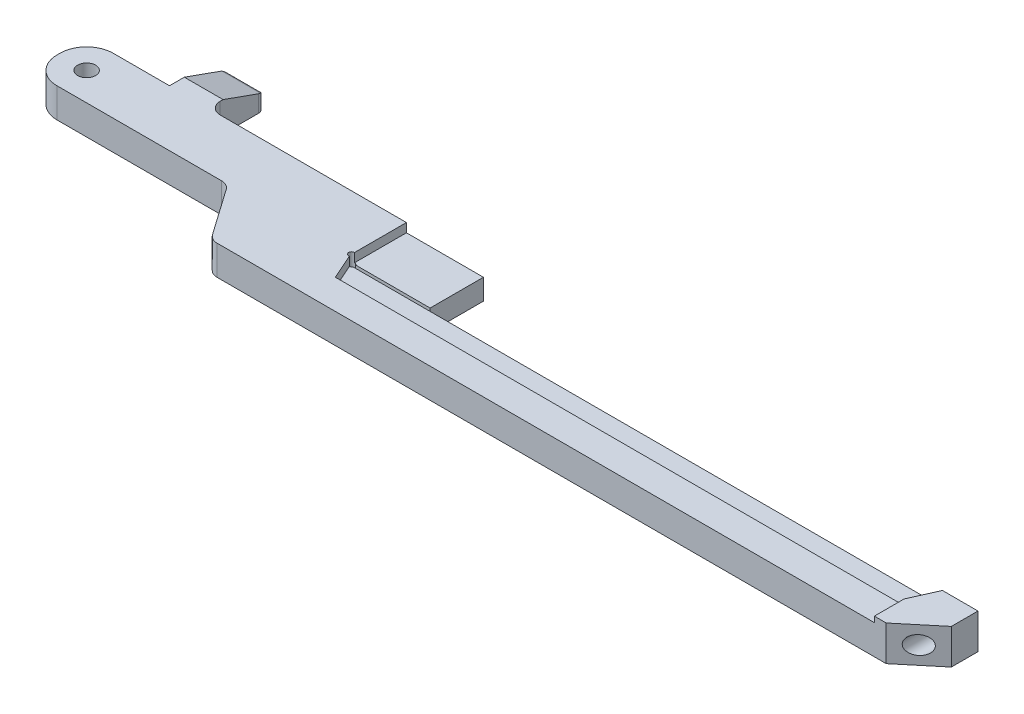
ISO-10303-21;
HEADER;
FILE_DESCRIPTION(('STEP AP214'),'2;1');
FILE_NAME('part.step','',(''),(''),'','','');
FILE_SCHEMA(('AUTOMOTIVE_DESIGN { 1 0 10303 214 1 1 1 1 }'));
ENDSEC;
DATA;
#1=APPLICATION_CONTEXT('core data for automotive mechanical design processes');
#2=APPLICATION_PROTOCOL_DEFINITION('international standard','automotive_design',2000,#1);
#3=PRODUCT_CONTEXT('',#1,'mechanical');
#4=PRODUCT('Part','Part','',(#3));
#5=PRODUCT_RELATED_PRODUCT_CATEGORY('part','',(#4));
#6=PRODUCT_DEFINITION_FORMATION('','',#4);
#7=PRODUCT_DEFINITION_CONTEXT('part definition',#1,'design');
#8=PRODUCT_DEFINITION('design','',#6,#7);
#9=PRODUCT_DEFINITION_SHAPE('','',#8);
#10=(LENGTH_UNIT() NAMED_UNIT(*) SI_UNIT(.MILLI.,.METRE.));
#11=(NAMED_UNIT(*) PLANE_ANGLE_UNIT() SI_UNIT($,.RADIAN.));
#12=(NAMED_UNIT(*) SI_UNIT($,.STERADIAN.) SOLID_ANGLE_UNIT());
#13=UNCERTAINTY_MEASURE_WITH_UNIT(LENGTH_MEASURE(1.E-05),#10,'distance_accuracy_value','');
#14=(GEOMETRIC_REPRESENTATION_CONTEXT(3) GLOBAL_UNCERTAINTY_ASSIGNED_CONTEXT((#13)) GLOBAL_UNIT_ASSIGNED_CONTEXT((#10,
#11,#12)) REPRESENTATION_CONTEXT('',''));
#15=CARTESIAN_POINT('',(0.,0.,0.));
#16=DIRECTION('',(0.,0.,1.));
#17=DIRECTION('',(1.,0.,0.));
#18=AXIS2_PLACEMENT_3D('',#15,#16,#17);
#19=CARTESIAN_POINT('',(0.,5.,0.));
#20=DIRECTION('',(0.,1.,0.));
#21=DIRECTION('',(0.,0.,1.));
#22=AXIS2_PLACEMENT_3D('',#19,#20,#21);
#23=PLANE('',#22);
#24=CARTESIAN_POINT('',(25.75,5.,4.75));
#25=DIRECTION('',(0.,1.,0.));
#26=DIRECTION('',(0.,0.,1.));
#27=AXIS2_PLACEMENT_3D('',#24,#25,#26);
#28=CIRCLE('',#27,1.525);
#29=CARTESIAN_POINT('',(25.75,5.,6.275));
#30=VERTEX_POINT('',#29);
#31=EDGE_CURVE('E333',#30,#30,#28,.T.);
#32=ORIENTED_EDGE('',*,*,#31,.F.);
#33=EDGE_LOOP('',(#32));
#34=FACE_BOUND('',#33,.T.);
#35=DIRECTION('',(-0.574425749096431,0.,-0.818556692462412));
#36=VECTOR('',#35,1.);
#37=CARTESIAN_POINT('',(31.9383378016085,5.,-22.4128686327078));
#38=LINE('',#37,#36);
#39=CARTESIAN_POINT('',(60.4027028057494,5.,18.1488514981929));
#40=VERTEX_POINT('',#39);
#41=CARTESIAN_POINT('',(54.9306305275839,5.,10.3511485018071));
#42=VERTEX_POINT('',#41);
#43=EDGE_CURVE('E284',#40,#42,#38,.T.);
#44=ORIENTED_EDGE('',*,*,#43,.F.);
#45=CARTESIAN_POINT('',(62.0398161906742,5.,17.));
#46=DIRECTION('',(0.,1.,0.));
#47=DIRECTION('',(0.,0.,1.));
#48=AXIS2_PLACEMENT_3D('',#45,#46,#47);
#49=CIRCLE('',#48,2.);
#50=CARTESIAN_POINT('',(62.0398161906742,5.,19.));
#51=VERTEX_POINT('',#50);
#52=EDGE_CURVE('E394',#40,#51,#49,.T.);
#53=ORIENTED_EDGE('',*,*,#52,.T.);
#54=DIRECTION('',(-1.,0.,0.));
#55=VECTOR('',#54,1.);
#56=CARTESIAN_POINT('',(0.,5.,19.0000000000001));
#57=LINE('',#56,#55);
#58=CARTESIAN_POINT('',(173.,5.,19.));
#59=VERTEX_POINT('',#58);
#60=EDGE_CURVE('E287',#59,#51,#57,.T.);
#61=ORIENTED_EDGE('',*,*,#60,.F.);
#62=DIRECTION('',(0.,0.,-1.));
#63=VECTOR('',#62,1.);
#64=CARTESIAN_POINT('',(173.,5.,0.));
#65=LINE('',#64,#63);
#66=CARTESIAN_POINT('',(173.,5.,14.));
#67=VERTEX_POINT('',#66);
#68=EDGE_CURVE('E488',#59,#67,#65,.T.);
#69=ORIENTED_EDGE('',*,*,#68,.T.);
#70=DIRECTION('',(1.,0.,0.));
#71=VECTOR('',#70,1.);
#72=CARTESIAN_POINT('',(173.,5.,14.));
#73=LINE('',#72,#71);
#74=CARTESIAN_POINT('',(77.,5.,14.));
#75=VERTEX_POINT('',#74);
#76=EDGE_CURVE('E491',#75,#67,#73,.T.);
#77=ORIENTED_EDGE('',*,*,#76,.F.);
#78=DIRECTION('',(-0.406138466053451,0.,-0.913811548620256));
#79=VECTOR('',#78,1.);
#80=CARTESIAN_POINT('',(59.1030927835049,5.,-26.2680412371136));
#81=LINE('',#80,#79);
#82=CARTESIAN_POINT('',(75.1060546548658,5.,9.73862297344813));
#83=VERTEX_POINT('',#82);
#84=EDGE_CURVE('E351',#75,#83,#81,.T.);
#85=ORIENTED_EDGE('',*,*,#84,.T.);
#86=CARTESIAN_POINT('',(75.,5.,9.25));
#87=DIRECTION('',(0.,1.,0.));
#88=DIRECTION('',(0.,0.,1.));
#89=AXIS2_PLACEMENT_3D('',#86,#87,#88);
#90=CIRCLE('',#89,0.500000000000002);
#91=CARTESIAN_POINT('',(75.,5.,8.75));
#92=VERTEX_POINT('',#91);
#93=EDGE_CURVE('E273',#92,#83,#90,.T.);
#94=ORIENTED_EDGE('',*,*,#93,.F.);
#95=DIRECTION('',(0.,0.,1.));
#96=VECTOR('',#95,1.);
#97=CARTESIAN_POINT('',(75.,5.,9.));
#98=LINE('',#97,#96);
#99=CARTESIAN_POINT('',(75.,5.,0.));
#100=VERTEX_POINT('',#99);
#101=EDGE_CURVE('E545',#100,#92,#98,.T.);
#102=ORIENTED_EDGE('',*,*,#101,.F.);
#103=DIRECTION('',(-1.,0.,0.));
#104=VECTOR('',#103,1.);
#105=CARTESIAN_POINT('',(0.,5.,0.));
#106=LINE('',#105,#104);
#107=CARTESIAN_POINT('',(43.55,5.,0.));
#108=VERTEX_POINT('',#107);
#109=EDGE_CURVE('E269',#100,#108,#106,.T.);
#110=ORIENTED_EDGE('',*,*,#109,.T.);
#111=CARTESIAN_POINT('',(43.55,5.,-2.));
#112=DIRECTION('',(0.,1.,0.));
#113=DIRECTION('',(0.,0.,1.));
#114=AXIS2_PLACEMENT_3D('',#111,#112,#113);
#115=CIRCLE('',#114,2.);
#116=CARTESIAN_POINT('',(41.55,5.,-2.));
#117=VERTEX_POINT('',#116);
#118=EDGE_CURVE('E267',#108,#117,#115,.F.);
#119=ORIENTED_EDGE('',*,*,#118,.T.);
#120=DIRECTION('',(0.,0.,1.));
#121=VECTOR('',#120,1.);
#122=CARTESIAN_POINT('',(41.55,5.,0.));
#123=LINE('',#122,#121);
#124=CARTESIAN_POINT('',(41.55,5.,-2.5));
#125=VERTEX_POINT('',#124);
#126=EDGE_CURVE('E250',#125,#117,#123,.T.);
#127=ORIENTED_EDGE('',*,*,#126,.F.);
#128=DIRECTION('',(-1.,0.,0.));
#129=VECTOR('',#128,1.);
#130=CARTESIAN_POINT('',(181.,5.,-2.5));
#131=LINE('',#130,#129);
#132=CARTESIAN_POINT('',(35.,5.,-2.5));
#133=VERTEX_POINT('',#132);
#134=EDGE_CURVE('E255',#125,#133,#131,.T.);
#135=ORIENTED_EDGE('',*,*,#134,.T.);
#136=DIRECTION('',(0.,0.,1.));
#137=VECTOR('',#136,1.);
#138=CARTESIAN_POINT('',(35.,5.,0.));
#139=LINE('',#138,#137);
#140=CARTESIAN_POINT('',(35.,5.,0.));
#141=VERTEX_POINT('',#140);
#142=EDGE_CURVE('E268',#133,#141,#139,.T.);
#143=ORIENTED_EDGE('',*,*,#142,.T.);
#144=DIRECTION('',(-1.,0.,0.));
#145=VECTOR('',#144,1.);
#146=CARTESIAN_POINT('',(0.,5.,0.));
#147=LINE('',#146,#145);
#148=CARTESIAN_POINT('',(25.5,5.,0.));
#149=VERTEX_POINT('',#148);
#150=EDGE_CURVE('E271',#141,#149,#147,.T.);
#151=ORIENTED_EDGE('',*,*,#150,.T.);
#152=CARTESIAN_POINT('',(25.5,5.,4.5));
#153=DIRECTION('',(0.,1.,0.));
#154=DIRECTION('',(0.,0.,1.));
#155=AXIS2_PLACEMENT_3D('',#152,#153,#154);
#156=CIRCLE('',#155,4.5);
#157=CARTESIAN_POINT('',(21.,5.,4.5));
#158=VERTEX_POINT('',#157);
#159=EDGE_CURVE('E374',#149,#158,#156,.T.);
#160=ORIENTED_EDGE('',*,*,#159,.T.);
#161=DIRECTION('',(0.,0.,-1.));
#162=VECTOR('',#161,1.);
#163=CARTESIAN_POINT('',(21.,5.,0.));
#164=LINE('',#163,#162);
#165=CARTESIAN_POINT('',(21.,5.,5.));
#166=VERTEX_POINT('',#165);
#167=EDGE_CURVE('E279',#166,#158,#164,.T.);
#168=ORIENTED_EDGE('',*,*,#167,.F.);
#169=CARTESIAN_POINT('',(25.5,5.,5.));
#170=DIRECTION('',(0.,1.,0.));
#171=DIRECTION('',(0.,0.,1.));
#172=AXIS2_PLACEMENT_3D('',#169,#170,#171);
#173=CIRCLE('',#172,4.5);
#174=CARTESIAN_POINT('',(25.5,5.,9.5));
#175=VERTEX_POINT('',#174);
#176=EDGE_CURVE('E376',#166,#175,#173,.T.);
#177=ORIENTED_EDGE('',*,*,#176,.T.);
#178=DIRECTION('',(-1.,0.,0.));
#179=VECTOR('',#178,1.);
#180=CARTESIAN_POINT('',(0.,5.,9.5));
#181=LINE('',#180,#179);
#182=CARTESIAN_POINT('',(53.2935171426591,5.,9.5));
#183=VERTEX_POINT('',#182);
#184=EDGE_CURVE('E282',#183,#175,#181,.T.);
#185=ORIENTED_EDGE('',*,*,#184,.F.);
#186=CARTESIAN_POINT('',(53.2935171426591,5.,11.5));
#187=DIRECTION('',(0.,1.,0.));
#188=DIRECTION('',(0.,0.,1.));
#189=AXIS2_PLACEMENT_3D('',#186,#187,#188);
#190=CIRCLE('',#189,2.);
#191=EDGE_CURVE('E402',#183,#42,#190,.F.);
#192=ORIENTED_EDGE('',*,*,#191,.T.);
#193=EDGE_LOOP('',(#44,#53,#61,#69,#77,#85,#94,#102,#110,#119,#127,#135,#143,#151,#160,#168,
#177,#185,#192));
#194=FACE_BOUND('',#193,.T.);
#195=ADVANCED_FACE('F40',(#34,#194),#23,.T.);
#196=CARTESIAN_POINT('',(41.55,5.,0.));
#197=DIRECTION('',(1.,0.,0.));
#198=DIRECTION('',(0.,0.,-1.));
#199=AXIS2_PLACEMENT_3D('',#196,#197,#198);
#200=PLANE('',#199);
#201=DIRECTION('',(0.,0.,1.));
#202=VECTOR('',#201,1.);
#203=CARTESIAN_POINT('',(41.55,0.,0.));
#204=LINE('',#203,#202);
#205=CARTESIAN_POINT('',(41.55,0.,-8.5));
#206=VERTEX_POINT('',#205);
#207=CARTESIAN_POINT('',(41.55,0.,-2.));
#208=VERTEX_POINT('',#207);
#209=EDGE_CURVE('E304',#206,#208,#204,.T.);
#210=ORIENTED_EDGE('',*,*,#209,.F.);
#211=DIRECTION('',(0.,-1.,0.));
#212=VECTOR('',#211,1.);
#213=CARTESIAN_POINT('',(41.55,5.,-8.5));
#214=LINE('',#213,#212);
#215=CARTESIAN_POINT('',(41.55,2.85714285714286,-8.5));
#216=VERTEX_POINT('',#215);
#217=EDGE_CURVE('E253',#206,#216,#214,.F.);
#218=ORIENTED_EDGE('',*,*,#217,.T.);
#219=DIRECTION('',(0.,0.336336396998156,0.941741911594838));
#220=VECTOR('',#219,1.);
#221=CARTESIAN_POINT('',(41.55,5.79185520361991,-0.282805429864254));
#222=LINE('',#221,#220);
#223=EDGE_CURVE('E244',#216,#125,#222,.T.);
#224=ORIENTED_EDGE('',*,*,#223,.T.);
#225=ORIENTED_EDGE('',*,*,#126,.T.);
#226=DIRECTION('',(0.,-1.,0.));
#227=VECTOR('',#226,1.);
#228=CARTESIAN_POINT('',(41.55,5.,-2.));
#229=LINE('',#228,#227);
#230=EDGE_CURVE('E396',#117,#208,#229,.T.);
#231=ORIENTED_EDGE('',*,*,#230,.T.);
#232=EDGE_LOOP('',(#210,#218,#224,#225,#231));
#233=FACE_BOUND('',#232,.T.);
#234=ADVANCED_FACE('F247',(#233),#200,.T.);
#235=CARTESIAN_POINT('',(0.,5.,-9.5));
#236=DIRECTION('',(0.,0.,-1.));
#237=DIRECTION('',(-1.,0.,0.));
#238=AXIS2_PLACEMENT_3D('',#235,#236,#237);
#239=PLANE('',#238);
#240=DIRECTION('',(-1.,0.,0.));
#241=VECTOR('',#240,1.);
#242=CARTESIAN_POINT('',(0.,1.79528080376296,-9.5));
#243=LINE('',#242,#241);
#244=CARTESIAN_POINT('',(36.,1.79528080376296,-9.5));
#245=VERTEX_POINT('',#244);
#246=CARTESIAN_POINT('',(40.55,1.79528080376296,-9.5));
#247=VERTEX_POINT('',#246);
#248=EDGE_CURVE('E407',#245,#247,#243,.F.);
#249=ORIENTED_EDGE('',*,*,#248,.T.);
#250=DIRECTION('',(0.,-1.,0.));
#251=VECTOR('',#250,1.);
#252=CARTESIAN_POINT('',(40.55,5.,-9.5));
#253=LINE('',#252,#251);
#254=CARTESIAN_POINT('',(40.55,0.,-9.5));
#255=VERTEX_POINT('',#254);
#256=EDGE_CURVE('E411',#247,#255,#253,.T.);
#257=ORIENTED_EDGE('',*,*,#256,.T.);
#258=DIRECTION('',(1.,0.,0.));
#259=VECTOR('',#258,1.);
#260=CARTESIAN_POINT('',(0.,0.,-9.5));
#261=LINE('',#260,#259);
#262=CARTESIAN_POINT('',(36.,0.,-9.5));
#263=VERTEX_POINT('',#262);
#264=EDGE_CURVE('E306',#263,#255,#261,.T.);
#265=ORIENTED_EDGE('',*,*,#264,.F.);
#266=DIRECTION('',(0.,-1.,0.));
#267=VECTOR('',#266,1.);
#268=CARTESIAN_POINT('',(36.,2.5,-9.5));
#269=LINE('',#268,#267);
#270=EDGE_CURVE('E409',#263,#245,#269,.F.);
#271=ORIENTED_EDGE('',*,*,#270,.T.);
#272=EDGE_LOOP('',(#249,#257,#265,#271));
#273=FACE_BOUND('',#272,.T.);
#274=ADVANCED_FACE('F602',(#273),#239,.T.);
#275=CARTESIAN_POINT('',(35.,5.,0.));
#276=DIRECTION('',(1.,0.,0.));
#277=DIRECTION('',(0.,0.,-1.));
#278=AXIS2_PLACEMENT_3D('',#275,#276,#277);
#279=PLANE('',#278);
#280=DIRECTION('',(0.,0.336336396998156,0.941741911594838));
#281=VECTOR('',#280,1.);
#282=CARTESIAN_POINT('',(35.,5.79185520361991,-0.282805429864254));
#283=LINE('',#282,#281);
#284=CARTESIAN_POINT('',(35.,2.85714285714286,-8.5));
#285=VERTEX_POINT('',#284);
#286=EDGE_CURVE('E260',#285,#133,#283,.T.);
#287=ORIENTED_EDGE('',*,*,#286,.F.);
#288=DIRECTION('',(0.,-1.,0.));
#289=VECTOR('',#288,1.);
#290=CARTESIAN_POINT('',(35.,0.,-8.5));
#291=LINE('',#290,#289);
#292=CARTESIAN_POINT('',(35.,0.,-8.5));
#293=VERTEX_POINT('',#292);
#294=EDGE_CURVE('E11',#285,#293,#291,.T.);
#295=ORIENTED_EDGE('',*,*,#294,.T.);
#296=DIRECTION('',(0.,0.,1.));
#297=VECTOR('',#296,1.);
#298=CARTESIAN_POINT('',(35.,0.,0.));
#299=LINE('',#298,#297);
#300=CARTESIAN_POINT('',(35.,0.,0.));
#301=VERTEX_POINT('',#300);
#302=EDGE_CURVE('E309',#293,#301,#299,.T.);
#303=ORIENTED_EDGE('',*,*,#302,.T.);
#304=DIRECTION('',(0.,-1.,0.));
#305=VECTOR('',#304,1.);
#306=CARTESIAN_POINT('',(35.,5.,0.));
#307=LINE('',#306,#305);
#308=EDGE_CURVE('E342',#141,#301,#307,.T.);
#309=ORIENTED_EDGE('',*,*,#308,.F.);
#310=ORIENTED_EDGE('',*,*,#142,.F.);
#311=EDGE_LOOP('',(#287,#295,#303,#309,#310));
#312=FACE_BOUND('',#311,.T.);
#313=ADVANCED_FACE('F437',(#312),#279,.F.);
#314=CARTESIAN_POINT('',(75.,5.,9.25));
#315=DIRECTION('',(0.,-1.,0.));
#316=DIRECTION('',(0.,0.,-1.));
#317=AXIS2_PLACEMENT_3D('',#314,#315,#316);
#318=CYLINDRICAL_SURFACE('',#317,0.500000000000002);
#319=CARTESIAN_POINT('',(75.,3.5,9.25));
#320=DIRECTION('',(0.,-1.,0.));
#321=DIRECTION('',(0.,0.,-1.));
#322=AXIS2_PLACEMENT_3D('',#319,#320,#321);
#323=CIRCLE('',#322,0.500000000000002);
#324=CARTESIAN_POINT('',(75.,3.5,8.75));
#325=VERTEX_POINT('',#324);
#326=CARTESIAN_POINT('',(75.4330127018922,3.5,9.));
#327=VERTEX_POINT('',#326);
#328=EDGE_CURVE('E295',#325,#327,#323,.T.);
#329=ORIENTED_EDGE('',*,*,#328,.F.);
#330=DIRECTION('',(0.,-1.,0.));
#331=VECTOR('',#330,1.);
#332=CARTESIAN_POINT('',(75.,5.,8.75));
#333=LINE('',#332,#331);
#334=EDGE_CURVE('E531',#325,#92,#333,.F.);
#335=ORIENTED_EDGE('',*,*,#334,.T.);
#336=ORIENTED_EDGE('',*,*,#93,.T.);
#337=DIRECTION('',(0.,-1.,0.));
#338=VECTOR('',#337,1.);
#339=CARTESIAN_POINT('',(75.1060546548658,5.,9.73862297344813));
#340=LINE('',#339,#338);
#341=CARTESIAN_POINT('',(75.1060546548658,3.5,9.73862297344813));
#342=VERTEX_POINT('',#341);
#343=EDGE_CURVE('E528',#83,#342,#340,.T.);
#344=ORIENTED_EDGE('',*,*,#343,.T.);
#345=CARTESIAN_POINT('',(75.,3.5,9.25));
#346=DIRECTION('',(0.,-1.,0.));
#347=DIRECTION('',(0.,0.,-1.));
#348=AXIS2_PLACEMENT_3D('',#345,#346,#347);
#349=CIRCLE('',#348,0.500000000000002);
#350=CARTESIAN_POINT('',(75.4330127018922,3.5,9.5));
#351=VERTEX_POINT('',#350);
#352=EDGE_CURVE('E534',#351,#342,#349,.T.);
#353=ORIENTED_EDGE('',*,*,#352,.F.);
#354=DIRECTION('',(0.,-1.,0.));
#355=VECTOR('',#354,1.);
#356=CARTESIAN_POINT('',(75.4330127018922,5.,9.5));
#357=LINE('',#356,#355);
#358=CARTESIAN_POINT('',(75.4330127018922,0.,9.5));
#359=VERTEX_POINT('',#358);
#360=EDGE_CURVE('E290',#351,#359,#357,.T.);
#361=ORIENTED_EDGE('',*,*,#360,.T.);
#362=CARTESIAN_POINT('',(75.,0.,9.25));
#363=DIRECTION('',(0.,1.,0.));
#364=DIRECTION('',(0.,0.,1.));
#365=AXIS2_PLACEMENT_3D('',#362,#363,#364);
#366=CIRCLE('',#365,0.500000000000002);
#367=CARTESIAN_POINT('',(75.4330127018922,0.,9.));
#368=VERTEX_POINT('',#367);
#369=EDGE_CURVE('E291',#368,#359,#366,.T.);
#370=ORIENTED_EDGE('',*,*,#369,.F.);
#371=DIRECTION('',(0.,-1.,0.));
#372=VECTOR('',#371,1.);
#373=CARTESIAN_POINT('',(75.4330127018922,5.,9.));
#374=LINE('',#373,#372);
#375=EDGE_CURVE('E349',#327,#368,#374,.T.);
#376=ORIENTED_EDGE('',*,*,#375,.F.);
#377=EDGE_LOOP('',(#329,#335,#336,#344,#353,#361,#370,#376));
#378=FACE_BOUND('',#377,.T.);
#379=ADVANCED_FACE('F542',(#378),#318,.F.);
#380=CARTESIAN_POINT('',(0.,5.,0.));
#381=DIRECTION('',(0.,0.,1.));
#382=DIRECTION('',(1.,0.,0.));
#383=AXIS2_PLACEMENT_3D('',#380,#381,#382);
#384=PLANE('',#383);
#385=DIRECTION('',(-1.,0.,0.));
#386=VECTOR('',#385,1.);
#387=CARTESIAN_POINT('',(0.,0.,0.));
#388=LINE('',#387,#386);
#389=CARTESIAN_POINT('',(88.,0.,0.));
#390=VERTEX_POINT('',#389);
#391=CARTESIAN_POINT('',(43.55,0.,0.));
#392=VERTEX_POINT('',#391);
#393=EDGE_CURVE('E301',#390,#392,#388,.T.);
#394=ORIENTED_EDGE('',*,*,#393,.T.);
#395=DIRECTION('',(0.,-1.,0.));
#396=VECTOR('',#395,1.);
#397=CARTESIAN_POINT('',(43.55,5.,0.));
#398=LINE('',#397,#396);
#399=EDGE_CURVE('E398',#392,#108,#398,.F.);
#400=ORIENTED_EDGE('',*,*,#399,.T.);
#401=ORIENTED_EDGE('',*,*,#109,.F.);
#402=DIRECTION('',(0.,-1.,0.));
#403=VECTOR('',#402,1.);
#404=CARTESIAN_POINT('',(75.,5.,0.));
#405=LINE('',#404,#403);
#406=CARTESIAN_POINT('',(75.,3.5,0.));
#407=VERTEX_POINT('',#406);
#408=EDGE_CURVE('E520',#100,#407,#405,.T.);
#409=ORIENTED_EDGE('',*,*,#408,.T.);
#410=DIRECTION('',(-1.,0.,0.));
#411=VECTOR('',#410,1.);
#412=CARTESIAN_POINT('',(75.,3.5,0.));
#413=LINE('',#412,#411);
#414=CARTESIAN_POINT('',(88.,3.5,0.));
#415=VERTEX_POINT('',#414);
#416=EDGE_CURVE('E571',#415,#407,#413,.T.);
#417=ORIENTED_EDGE('',*,*,#416,.F.);
#418=DIRECTION('',(0.,-1.,0.));
#419=VECTOR('',#418,1.);
#420=CARTESIAN_POINT('',(88.,5.,0.));
#421=LINE('',#420,#419);
#422=EDGE_CURVE('E345',#415,#390,#421,.T.);
#423=ORIENTED_EDGE('',*,*,#422,.T.);
#424=EDGE_LOOP('',(#394,#400,#401,#409,#417,#423));
#425=FACE_BOUND('',#424,.T.);
#426=ADVANCED_FACE('F583',(#425),#384,.F.);
#427=CARTESIAN_POINT('',(0.,5.,9.5));
#428=DIRECTION('',(0.,0.,-1.));
#429=DIRECTION('',(-1.,0.,0.));
#430=AXIS2_PLACEMENT_3D('',#427,#428,#429);
#431=PLANE('',#430);
#432=CARTESIAN_POINT('',(178.,2.975,9.5));
#433=DIRECTION('',(0.,0.,-1.));
#434=DIRECTION('',(-1.,0.,0.));
#435=AXIS2_PLACEMENT_3D('',#432,#433,#434);
#436=CIRCLE('',#435,1.52500000000001);
#437=CARTESIAN_POINT('',(176.475,2.975,9.5));
#438=VERTEX_POINT('',#437);
#439=EDGE_CURVE('E362',#438,#438,#436,.F.);
#440=ORIENTED_EDGE('',*,*,#439,.T.);
#441=EDGE_LOOP('',(#440));
#442=FACE_BOUND('',#441,.T.);
#443=DIRECTION('',(0.,-1.,0.));
#444=VECTOR('',#443,1.);
#445=CARTESIAN_POINT('',(181.,5.,9.5));
#446=LINE('',#445,#444);
#447=CARTESIAN_POINT('',(181.,5.95,9.5));
#448=VERTEX_POINT('',#447);
#449=CARTESIAN_POINT('',(181.,0.,9.5));
#450=VERTEX_POINT('',#449);
#451=EDGE_CURVE('E335',#448,#450,#446,.T.);
#452=ORIENTED_EDGE('',*,*,#451,.T.);
#453=DIRECTION('',(1.,0.,0.));
#454=VECTOR('',#453,1.);
#455=CARTESIAN_POINT('',(0.,0.,9.5));
#456=LINE('',#455,#454);
#457=EDGE_CURVE('E331',#359,#450,#456,.T.);
#458=ORIENTED_EDGE('',*,*,#457,.F.);
#459=ORIENTED_EDGE('',*,*,#360,.F.);
#460=DIRECTION('',(-1.,0.,0.));
#461=VECTOR('',#460,1.);
#462=CARTESIAN_POINT('',(75.4330127018922,3.5,9.5));
#463=LINE('',#462,#461);
#464=CARTESIAN_POINT('',(175.,3.5,9.5));
#465=VERTEX_POINT('',#464);
#466=EDGE_CURVE('E514',#465,#351,#463,.T.);
#467=ORIENTED_EDGE('',*,*,#466,.F.);
#468=DIRECTION('',(0.,-1.,0.));
#469=VECTOR('',#468,1.);
#470=CARTESIAN_POINT('',(175.,5.,9.5));
#471=LINE('',#470,#469);
#472=CARTESIAN_POINT('',(175.,5.95,9.5));
#473=VERTEX_POINT('',#472);
#474=EDGE_CURVE('E509',#473,#465,#471,.T.);
#475=ORIENTED_EDGE('',*,*,#474,.F.);
#476=DIRECTION('',(-1.,0.,0.));
#477=VECTOR('',#476,1.);
#478=CARTESIAN_POINT('',(181.,5.95,9.5));
#479=LINE('',#478,#477);
#480=EDGE_CURVE('E967',#448,#473,#479,.T.);
#481=ORIENTED_EDGE('',*,*,#480,.F.);
#482=EDGE_LOOP('',(#452,#458,#459,#467,#475,#481));
#483=FACE_BOUND('',#482,.T.);
#484=ADVANCED_FACE('F557',(#442,#483),#431,.T.);
#485=CARTESIAN_POINT('',(0.,5.,9.));
#486=DIRECTION('',(0.,0.,1.));
#487=DIRECTION('',(1.,0.,0.));
#488=AXIS2_PLACEMENT_3D('',#485,#486,#487);
#489=PLANE('',#488);
#490=DIRECTION('',(1.,0.,0.));
#491=VECTOR('',#490,1.);
#492=CARTESIAN_POINT('',(75.4330127018922,3.5,9.));
#493=LINE('',#492,#491);
#494=CARTESIAN_POINT('',(88.,3.5,9.));
#495=VERTEX_POINT('',#494);
#496=EDGE_CURVE('E527',#327,#495,#493,.T.);
#497=ORIENTED_EDGE('',*,*,#496,.F.);
#498=ORIENTED_EDGE('',*,*,#375,.T.);
#499=DIRECTION('',(-1.,0.,0.));
#500=VECTOR('',#499,1.);
#501=CARTESIAN_POINT('',(0.,0.,9.));
#502=LINE('',#501,#500);
#503=CARTESIAN_POINT('',(88.,0.,9.));
#504=VERTEX_POINT('',#503);
#505=EDGE_CURVE('E294',#504,#368,#502,.T.);
#506=ORIENTED_EDGE('',*,*,#505,.F.);
#507=DIRECTION('',(0.,-1.,0.));
#508=VECTOR('',#507,1.);
#509=CARTESIAN_POINT('',(88.,5.,9.));
#510=LINE('',#509,#508);
#511=EDGE_CURVE('E347',#495,#504,#510,.T.);
#512=ORIENTED_EDGE('',*,*,#511,.F.);
#513=EDGE_LOOP('',(#497,#498,#506,#512));
#514=FACE_BOUND('',#513,.T.);
#515=ADVANCED_FACE('F565',(#514),#489,.T.);
#516=CARTESIAN_POINT('',(88.,5.,0.));
#517=DIRECTION('',(-1.,0.,0.));
#518=DIRECTION('',(0.,0.,1.));
#519=AXIS2_PLACEMENT_3D('',#516,#517,#518);
#520=PLANE('',#519);
#521=ORIENTED_EDGE('',*,*,#422,.F.);
#522=DIRECTION('',(0.,0.,-1.));
#523=VECTOR('',#522,1.);
#524=CARTESIAN_POINT('',(88.,3.5,9.));
#525=LINE('',#524,#523);
#526=EDGE_CURVE('E569',#495,#415,#525,.T.);
#527=ORIENTED_EDGE('',*,*,#526,.F.);
#528=ORIENTED_EDGE('',*,*,#511,.T.);
#529=DIRECTION('',(0.,0.,-1.));
#530=VECTOR('',#529,1.);
#531=CARTESIAN_POINT('',(88.,0.,0.));
#532=LINE('',#531,#530);
#533=EDGE_CURVE('E298',#504,#390,#532,.T.);
#534=ORIENTED_EDGE('',*,*,#533,.T.);
#535=EDGE_LOOP('',(#521,#527,#528,#534));
#536=FACE_BOUND('',#535,.T.);
#537=ADVANCED_FACE('F633',(#536),#520,.F.);
#538=CARTESIAN_POINT('',(0.,5.,0.));
#539=DIRECTION('',(0.,0.,1.));
#540=DIRECTION('',(1.,0.,0.));
#541=AXIS2_PLACEMENT_3D('',#538,#539,#540);
#542=PLANE('',#541);
#543=DIRECTION('',(-1.,0.,0.));
#544=VECTOR('',#543,1.);
#545=CARTESIAN_POINT('',(0.,0.,0.));
#546=LINE('',#545,#544);
#547=CARTESIAN_POINT('',(25.5,0.,0.));
#548=VERTEX_POINT('',#547);
#549=EDGE_CURVE('E311',#301,#548,#546,.T.);
#550=ORIENTED_EDGE('',*,*,#549,.T.);
#551=DIRECTION('',(0.,-1.,0.));
#552=VECTOR('',#551,1.);
#553=CARTESIAN_POINT('',(25.5,5.,0.));
#554=LINE('',#553,#552);
#555=EDGE_CURVE('E379',#548,#149,#554,.F.);
#556=ORIENTED_EDGE('',*,*,#555,.T.);
#557=ORIENTED_EDGE('',*,*,#150,.F.);
#558=ORIENTED_EDGE('',*,*,#308,.T.);
#559=EDGE_LOOP('',(#550,#556,#557,#558));
#560=FACE_BOUND('',#559,.T.);
#561=ADVANCED_FACE('F443',(#560),#542,.F.);
#562=CARTESIAN_POINT('',(21.,5.,0.));
#563=DIRECTION('',(-1.,0.,0.));
#564=DIRECTION('',(0.,0.,1.));
#565=AXIS2_PLACEMENT_3D('',#562,#563,#564);
#566=PLANE('',#565);
#567=DIRECTION('',(0.,0.,-1.));
#568=VECTOR('',#567,1.);
#569=CARTESIAN_POINT('',(21.,0.,0.));
#570=LINE('',#569,#568);
#571=CARTESIAN_POINT('',(21.,0.,5.));
#572=VERTEX_POINT('',#571);
#573=CARTESIAN_POINT('',(21.,0.,4.5));
#574=VERTEX_POINT('',#573);
#575=EDGE_CURVE('E314',#572,#574,#570,.T.);
#576=ORIENTED_EDGE('',*,*,#575,.F.);
#577=DIRECTION('',(0.,-1.,0.));
#578=VECTOR('',#577,1.);
#579=CARTESIAN_POINT('',(21.,5.,5.));
#580=LINE('',#579,#578);
#581=EDGE_CURVE('E372',#572,#166,#580,.F.);
#582=ORIENTED_EDGE('',*,*,#581,.T.);
#583=ORIENTED_EDGE('',*,*,#167,.T.);
#584=DIRECTION('',(0.,-1.,0.));
#585=VECTOR('',#584,1.);
#586=CARTESIAN_POINT('',(21.,0.,4.5));
#587=LINE('',#586,#585);
#588=EDGE_CURVE('E369',#158,#574,#587,.T.);
#589=ORIENTED_EDGE('',*,*,#588,.T.);
#590=EDGE_LOOP('',(#576,#582,#583,#589));
#591=FACE_BOUND('',#590,.T.);
#592=ADVANCED_FACE('F453',(#591),#566,.T.);
#593=CARTESIAN_POINT('',(0.,5.,9.5));
#594=DIRECTION('',(0.,0.,1.));
#595=DIRECTION('',(1.,0.,0.));
#596=AXIS2_PLACEMENT_3D('',#593,#594,#595);
#597=PLANE('',#596);
#598=DIRECTION('',(-1.,0.,0.));
#599=VECTOR('',#598,1.);
#600=CARTESIAN_POINT('',(0.,0.,9.5));
#601=LINE('',#600,#599);
#602=CARTESIAN_POINT('',(53.2935171426591,0.,9.5));
#603=VERTEX_POINT('',#602);
#604=CARTESIAN_POINT('',(25.5,0.,9.5));
#605=VERTEX_POINT('',#604);
#606=EDGE_CURVE('E317',#603,#605,#601,.T.);
#607=ORIENTED_EDGE('',*,*,#606,.F.);
#608=DIRECTION('',(0.,-1.,0.));
#609=VECTOR('',#608,1.);
#610=CARTESIAN_POINT('',(53.2935171426591,5.,9.5));
#611=LINE('',#610,#609);
#612=EDGE_CURVE('E387',#603,#183,#611,.F.);
#613=ORIENTED_EDGE('',*,*,#612,.T.);
#614=ORIENTED_EDGE('',*,*,#184,.T.);
#615=DIRECTION('',(0.,-1.,0.));
#616=VECTOR('',#615,1.);
#617=CARTESIAN_POINT('',(25.5,5.,9.5));
#618=LINE('',#617,#616);
#619=EDGE_CURVE('E354',#175,#605,#618,.T.);
#620=ORIENTED_EDGE('',*,*,#619,.T.);
#621=EDGE_LOOP('',(#607,#613,#614,#620));
#622=FACE_BOUND('',#621,.T.);
#623=ADVANCED_FACE('F626',(#622),#597,.T.);
#624=CARTESIAN_POINT('',(31.9383378016085,5.,-22.4128686327078));
#625=DIRECTION('',(-0.818556692462413,0.,0.574425749096431));
#626=DIRECTION('',(0.574425749096431,0.,0.818556692462413));
#627=AXIS2_PLACEMENT_3D('',#624,#625,#626);
#628=PLANE('',#627);
#629=ORIENTED_EDGE('',*,*,#43,.T.);
#630=DIRECTION('',(0.,-1.,0.));
#631=VECTOR('',#630,1.);
#632=CARTESIAN_POINT('',(54.9306305275839,0.,10.3511485018071));
#633=LINE('',#632,#631);
#634=CARTESIAN_POINT('',(54.9306305275839,0.,10.3511485018071));
#635=VERTEX_POINT('',#634);
#636=EDGE_CURVE('E384',#42,#635,#633,.T.);
#637=ORIENTED_EDGE('',*,*,#636,.T.);
#638=DIRECTION('',(-0.574425749096431,0.,-0.818556692462412));
#639=VECTOR('',#638,1.);
#640=CARTESIAN_POINT('',(31.9383378016085,0.,-22.4128686327078));
#641=LINE('',#640,#639);
#642=CARTESIAN_POINT('',(60.4027028057494,0.,18.1488514981929));
#643=VERTEX_POINT('',#642);
#644=EDGE_CURVE('E319',#643,#635,#641,.T.);
#645=ORIENTED_EDGE('',*,*,#644,.F.);
#646=DIRECTION('',(0.,-1.,0.));
#647=VECTOR('',#646,1.);
#648=CARTESIAN_POINT('',(60.4027028057494,5.,18.1488514981929));
#649=LINE('',#648,#647);
#650=EDGE_CURVE('E382',#643,#40,#649,.F.);
#651=ORIENTED_EDGE('',*,*,#650,.T.);
#652=EDGE_LOOP('',(#629,#637,#645,#651));
#653=FACE_BOUND('',#652,.T.);
#654=ADVANCED_FACE('F468',(#653),#628,.T.);
#655=CARTESIAN_POINT('',(0.,5.,19.0000000000001));
#656=DIRECTION('',(0.,0.,1.));
#657=DIRECTION('',(1.,0.,0.));
#658=AXIS2_PLACEMENT_3D('',#655,#656,#657);
#659=PLANE('',#658);
#660=ORIENTED_EDGE('',*,*,#60,.T.);
#661=DIRECTION('',(0.,-1.,0.));
#662=VECTOR('',#661,1.);
#663=CARTESIAN_POINT('',(62.0398161906742,5.,19.));
#664=LINE('',#663,#662);
#665=CARTESIAN_POINT('',(62.0398161906742,0.,19.));
#666=VERTEX_POINT('',#665);
#667=EDGE_CURVE('E389',#51,#666,#664,.T.);
#668=ORIENTED_EDGE('',*,*,#667,.T.);
#669=DIRECTION('',(-1.,0.,0.));
#670=VECTOR('',#669,1.);
#671=CARTESIAN_POINT('',(0.,0.,19.0000000000001));
#672=LINE('',#671,#670);
#673=CARTESIAN_POINT('',(175.,0.,19.));
#674=VERTEX_POINT('',#673);
#675=EDGE_CURVE('E322',#674,#666,#672,.T.);
#676=ORIENTED_EDGE('',*,*,#675,.F.);
#677=DIRECTION('',(0.,-1.,0.));
#678=VECTOR('',#677,1.);
#679=CARTESIAN_POINT('',(175.,5.,19.));
#680=LINE('',#679,#678);
#681=CARTESIAN_POINT('',(175.,5.95,19.));
#682=VERTEX_POINT('',#681);
#683=EDGE_CURVE('E340',#682,#674,#680,.T.);
#684=ORIENTED_EDGE('',*,*,#683,.F.);
#685=DIRECTION('',(1.,0.,0.));
#686=VECTOR('',#685,1.);
#687=CARTESIAN_POINT('',(173.,5.95,19.));
#688=LINE('',#687,#686);
#689=CARTESIAN_POINT('',(173.,5.95,19.));
#690=VERTEX_POINT('',#689);
#691=EDGE_CURVE('E976',#690,#682,#688,.T.);
#692=ORIENTED_EDGE('',*,*,#691,.F.);
#693=DIRECTION('',(0.,-1.,0.));
#694=VECTOR('',#693,1.);
#695=CARTESIAN_POINT('',(173.,5.95,19.));
#696=LINE('',#695,#694);
#697=EDGE_CURVE('E485',#690,#59,#696,.T.);
#698=ORIENTED_EDGE('',*,*,#697,.T.);
#699=EDGE_LOOP('',(#660,#668,#676,#684,#692,#698));
#700=FACE_BOUND('',#699,.T.);
#701=ADVANCED_FACE('F480',(#700),#659,.T.);
#702=CARTESIAN_POINT('',(81.0655737704917,5.,97.2786885245902));
#703=DIRECTION('',(0.64018439966448,0.,0.768221279597376));
#704=DIRECTION('',(0.768221279597376,0.,-0.64018439966448));
#705=AXIS2_PLACEMENT_3D('',#702,#703,#704);
#706=PLANE('',#705);
#707=CARTESIAN_POINT('',(178.,2.975,16.5));
#708=DIRECTION('',(0.64018439966448,0.,0.768221279597376));
#709=DIRECTION('',(0.768221279597376,0.,-0.64018439966448));
#710=AXIS2_PLACEMENT_3D('',#707,#708,#709);
#711=ELLIPSE('',#710,1.98510512595962,1.52500000000001);
#712=CARTESIAN_POINT('',(179.525,2.975,15.2291666666667));
#713=VERTEX_POINT('',#712);
#714=EDGE_CURVE('E254',#713,#713,#711,.F.);
#715=ORIENTED_EDGE('',*,*,#714,.T.);
#716=EDGE_LOOP('',(#715));
#717=FACE_BOUND('',#716,.T.);
#718=DIRECTION('',(-0.768221279597376,0.,0.64018439966448));
#719=VECTOR('',#718,1.);
#720=CARTESIAN_POINT('',(81.0655737704917,0.,97.2786885245902));
#721=LINE('',#720,#719);
#722=CARTESIAN_POINT('',(181.,0.,14.));
#723=VERTEX_POINT('',#722);
#724=EDGE_CURVE('E325',#723,#674,#721,.T.);
#725=ORIENTED_EDGE('',*,*,#724,.F.);
#726=DIRECTION('',(0.,-1.,0.));
#727=VECTOR('',#726,1.);
#728=CARTESIAN_POINT('',(181.,5.,14.));
#729=LINE('',#728,#727);
#730=CARTESIAN_POINT('',(181.,5.95,14.));
#731=VERTEX_POINT('',#730);
#732=EDGE_CURVE('E338',#731,#723,#729,.T.);
#733=ORIENTED_EDGE('',*,*,#732,.F.);
#734=DIRECTION('',(0.768221279597376,0.,-0.64018439966448));
#735=VECTOR('',#734,1.);
#736=CARTESIAN_POINT('',(175.,5.95,19.));
#737=LINE('',#736,#735);
#738=EDGE_CURVE('E973',#682,#731,#737,.T.);
#739=ORIENTED_EDGE('',*,*,#738,.F.);
#740=ORIENTED_EDGE('',*,*,#683,.T.);
#741=EDGE_LOOP('',(#725,#733,#739,#740));
#742=FACE_BOUND('',#741,.T.);
#743=ADVANCED_FACE('F617',(#717,#742),#706,.T.);
#744=CARTESIAN_POINT('',(181.,5.,0.));
#745=DIRECTION('',(1.,0.,0.));
#746=DIRECTION('',(0.,0.,-1.));
#747=AXIS2_PLACEMENT_3D('',#744,#745,#746);
#748=PLANE('',#747);
#749=DIRECTION('',(0.,0.,1.));
#750=VECTOR('',#749,1.);
#751=CARTESIAN_POINT('',(181.,0.,0.));
#752=LINE('',#751,#750);
#753=EDGE_CURVE('E328',#450,#723,#752,.T.);
#754=ORIENTED_EDGE('',*,*,#753,.F.);
#755=ORIENTED_EDGE('',*,*,#451,.F.);
#756=DIRECTION('',(0.,0.,-1.));
#757=VECTOR('',#756,1.);
#758=CARTESIAN_POINT('',(181.,5.95,14.));
#759=LINE('',#758,#757);
#760=EDGE_CURVE('E970',#731,#448,#759,.T.);
#761=ORIENTED_EDGE('',*,*,#760,.F.);
#762=ORIENTED_EDGE('',*,*,#732,.T.);
#763=EDGE_LOOP('',(#754,#755,#761,#762));
#764=FACE_BOUND('',#763,.T.);
#765=ADVANCED_FACE('F614',(#764),#748,.T.);
#766=CARTESIAN_POINT('',(25.75,5.,4.75));
#767=DIRECTION('',(0.,-1.,0.));
#768=DIRECTION('',(0.,0.,-1.));
#769=AXIS2_PLACEMENT_3D('',#766,#767,#768);
#770=CYLINDRICAL_SURFACE('',#769,1.525);
#771=CARTESIAN_POINT('',(25.75,2.,4.75));
#772=DIRECTION('',(0.,1.,0.));
#773=DIRECTION('',(0.,0.,1.));
#774=AXIS2_PLACEMENT_3D('',#771,#772,#773);
#775=CIRCLE('',#774,1.525);
#776=CARTESIAN_POINT('',(25.75,2.,6.275));
#777=VERTEX_POINT('',#776);
#778=EDGE_CURVE('E355',#777,#777,#775,.T.);
#779=ORIENTED_EDGE('',*,*,#778,.F.);
#780=EDGE_LOOP('',(#779));
#781=FACE_BOUND('',#780,.T.);
#782=ORIENTED_EDGE('',*,*,#31,.T.);
#783=EDGE_LOOP('',(#782));
#784=FACE_BOUND('',#783,.T.);
#785=ADVANCED_FACE('F610',(#781,#784),#770,.F.);
#786=CARTESIAN_POINT('',(0.,0.,0.));
#787=DIRECTION('',(0.,1.,0.));
#788=DIRECTION('',(0.,0.,1.));
#789=AXIS2_PLACEMENT_3D('',#786,#787,#788);
#790=PLANE('',#789);
#791=ORIENTED_EDGE('',*,*,#264,.T.);
#792=CARTESIAN_POINT('',(40.55,0.,-8.5));
#793=DIRECTION('',(0.,1.,0.));
#794=DIRECTION('',(0.,0.,1.));
#795=AXIS2_PLACEMENT_3D('',#792,#793,#794);
#796=CIRCLE('',#795,1.);
#797=EDGE_CURVE('E416',#255,#206,#796,.F.);
#798=ORIENTED_EDGE('',*,*,#797,.T.);
#799=ORIENTED_EDGE('',*,*,#209,.T.);
#800=CARTESIAN_POINT('',(43.55,0.,-2.));
#801=DIRECTION('',(0.,1.,0.));
#802=DIRECTION('',(0.,0.,1.));
#803=AXIS2_PLACEMENT_3D('',#800,#801,#802);
#804=CIRCLE('',#803,2.);
#805=EDGE_CURVE('E404',#208,#392,#804,.T.);
#806=ORIENTED_EDGE('',*,*,#805,.T.);
#807=ORIENTED_EDGE('',*,*,#393,.F.);
#808=ORIENTED_EDGE('',*,*,#533,.F.);
#809=ORIENTED_EDGE('',*,*,#505,.T.);
#810=ORIENTED_EDGE('',*,*,#369,.T.);
#811=ORIENTED_EDGE('',*,*,#457,.T.);
#812=ORIENTED_EDGE('',*,*,#753,.T.);
#813=ORIENTED_EDGE('',*,*,#724,.T.);
#814=ORIENTED_EDGE('',*,*,#675,.T.);
#815=CARTESIAN_POINT('',(62.0398161906742,0.,17.));
#816=DIRECTION('',(0.,1.,0.));
#817=DIRECTION('',(0.,0.,1.));
#818=AXIS2_PLACEMENT_3D('',#815,#816,#817);
#819=CIRCLE('',#818,2.);
#820=EDGE_CURVE('E392',#666,#643,#819,.F.);
#821=ORIENTED_EDGE('',*,*,#820,.T.);
#822=ORIENTED_EDGE('',*,*,#644,.T.);
#823=CARTESIAN_POINT('',(53.2935171426591,0.,11.5));
#824=DIRECTION('',(0.,1.,0.));
#825=DIRECTION('',(0.,0.,1.));
#826=AXIS2_PLACEMENT_3D('',#823,#824,#825);
#827=CIRCLE('',#826,2.);
#828=EDGE_CURVE('E400',#635,#603,#827,.T.);
#829=ORIENTED_EDGE('',*,*,#828,.T.);
#830=ORIENTED_EDGE('',*,*,#606,.T.);
#831=CARTESIAN_POINT('',(25.5,0.,5.));
#832=DIRECTION('',(0.,1.,0.));
#833=DIRECTION('',(0.,0.,1.));
#834=AXIS2_PLACEMENT_3D('',#831,#832,#833);
#835=CIRCLE('',#834,4.5);
#836=EDGE_CURVE('E367',#605,#572,#835,.F.);
#837=ORIENTED_EDGE('',*,*,#836,.T.);
#838=ORIENTED_EDGE('',*,*,#575,.T.);
#839=CARTESIAN_POINT('',(25.5,0.,4.5));
#840=DIRECTION('',(0.,1.,0.));
#841=DIRECTION('',(0.,0.,1.));
#842=AXIS2_PLACEMENT_3D('',#839,#840,#841);
#843=CIRCLE('',#842,4.5);
#844=EDGE_CURVE('E365',#574,#548,#843,.F.);
#845=ORIENTED_EDGE('',*,*,#844,.T.);
#846=ORIENTED_EDGE('',*,*,#549,.F.);
#847=ORIENTED_EDGE('',*,*,#302,.F.);
#848=CARTESIAN_POINT('',(36.,0.,-8.5));
#849=DIRECTION('',(0.,1.,0.));
#850=DIRECTION('',(0.,0.,1.));
#851=AXIS2_PLACEMENT_3D('',#848,#849,#850);
#852=CIRCLE('',#851,1.);
#853=EDGE_CURVE('E414',#293,#263,#852,.F.);
#854=ORIENTED_EDGE('',*,*,#853,.T.);
#855=EDGE_LOOP('',(#791,#798,#799,#806,#807,#808,#809,#810,#811,#812,#813,#814,#821,#822,#829,
#830,#837,#838,#845,#846,#847,#854));
#856=FACE_BOUND('',#855,.T.);
#857=CARTESIAN_POINT('',(25.75,0.,4.75));
#858=DIRECTION('',(0.,1.,0.));
#859=DIRECTION('',(0.,0.,1.));
#860=AXIS2_PLACEMENT_3D('',#857,#858,#859);
#861=CIRCLE('',#860,3.);
#862=CARTESIAN_POINT('',(25.75,0.,7.75));
#863=VERTEX_POINT('',#862);
#864=EDGE_CURVE('E493',#863,#863,#861,.T.);
#865=ORIENTED_EDGE('',*,*,#864,.T.);
#866=EDGE_LOOP('',(#865));
#867=FACE_BOUND('',#866,.T.);
#868=ADVANCED_FACE('F471',(#856,#867),#790,.F.);
#869=CARTESIAN_POINT('',(77.,5.,14.));
#870=DIRECTION('',(0.913811548620256,0.,-0.406138466053451));
#871=DIRECTION('',(-0.406138466053451,0.,-0.913811548620256));
#872=AXIS2_PLACEMENT_3D('',#869,#870,#871);
#873=PLANE('',#872);
#874=ORIENTED_EDGE('',*,*,#84,.F.);
#875=DIRECTION('',(0.,-1.,0.));
#876=VECTOR('',#875,1.);
#877=CARTESIAN_POINT('',(77.,5.,14.));
#878=LINE('',#877,#876);
#879=CARTESIAN_POINT('',(77.,3.5,14.));
#880=VERTEX_POINT('',#879);
#881=EDGE_CURVE('E508',#75,#880,#878,.T.);
#882=ORIENTED_EDGE('',*,*,#881,.T.);
#883=DIRECTION('',(0.406138466053451,0.,0.913811548620256));
#884=VECTOR('',#883,1.);
#885=CARTESIAN_POINT('',(77.,3.5,14.));
#886=LINE('',#885,#884);
#887=EDGE_CURVE('E358',#342,#880,#886,.T.);
#888=ORIENTED_EDGE('',*,*,#887,.F.);
#889=ORIENTED_EDGE('',*,*,#343,.F.);
#890=EDGE_LOOP('',(#874,#882,#888,#889));
#891=FACE_BOUND('',#890,.T.);
#892=ADVANCED_FACE('F548',(#891),#873,.T.);
#893=CARTESIAN_POINT('',(173.,5.,14.));
#894=DIRECTION('',(0.,0.,-1.));
#895=DIRECTION('',(-1.,0.,0.));
#896=AXIS2_PLACEMENT_3D('',#893,#894,#895);
#897=PLANE('',#896);
#898=DIRECTION('',(1.,0.,0.));
#899=VECTOR('',#898,1.);
#900=CARTESIAN_POINT('',(173.,3.5,14.));
#901=LINE('',#900,#899);
#902=CARTESIAN_POINT('',(173.,3.5,14.));
#903=VERTEX_POINT('',#902);
#904=EDGE_CURVE('E523',#880,#903,#901,.T.);
#905=ORIENTED_EDGE('',*,*,#904,.F.);
#906=ORIENTED_EDGE('',*,*,#881,.F.);
#907=ORIENTED_EDGE('',*,*,#76,.T.);
#908=DIRECTION('',(0.,-1.,0.));
#909=VECTOR('',#908,1.);
#910=CARTESIAN_POINT('',(173.,5.,14.));
#911=LINE('',#910,#909);
#912=EDGE_CURVE('E500',#67,#903,#911,.T.);
#913=ORIENTED_EDGE('',*,*,#912,.T.);
#914=EDGE_LOOP('',(#905,#906,#907,#913));
#915=FACE_BOUND('',#914,.T.);
#916=ADVANCED_FACE('F512',(#915),#897,.T.);
#917=CARTESIAN_POINT('',(173.,5.,14.));
#918=DIRECTION('',(-0.913811548620257,0.,-0.406138466053448));
#919=DIRECTION('',(-0.406138466053448,0.,0.913811548620257));
#920=AXIS2_PLACEMENT_3D('',#917,#918,#919);
#921=PLANE('',#920);
#922=DIRECTION('',(0.406138466053448,0.,-0.913811548620257));
#923=VECTOR('',#922,1.);
#924=CARTESIAN_POINT('',(173.,3.5,14.));
#925=LINE('',#924,#923);
#926=EDGE_CURVE('E505',#903,#465,#925,.T.);
#927=ORIENTED_EDGE('',*,*,#926,.F.);
#928=ORIENTED_EDGE('',*,*,#912,.F.);
#929=DIRECTION('',(0.,-1.,0.));
#930=VECTOR('',#929,1.);
#931=CARTESIAN_POINT('',(173.,5.95,14.));
#932=LINE('',#931,#930);
#933=CARTESIAN_POINT('',(173.,5.95,14.));
#934=VERTEX_POINT('',#933);
#935=EDGE_CURVE('E494',#934,#67,#932,.T.);
#936=ORIENTED_EDGE('',*,*,#935,.F.);
#937=DIRECTION('',(-0.406138466053438,0.,0.913811548620261));
#938=VECTOR('',#937,1.);
#939=CARTESIAN_POINT('',(175.,5.95,9.5));
#940=LINE('',#939,#938);
#941=EDGE_CURVE('E965',#473,#934,#940,.T.);
#942=ORIENTED_EDGE('',*,*,#941,.F.);
#943=ORIENTED_EDGE('',*,*,#474,.T.);
#944=EDGE_LOOP('',(#927,#928,#936,#942,#943));
#945=FACE_BOUND('',#944,.T.);
#946=ADVANCED_FACE('F501',(#945),#921,.T.);
#947=CARTESIAN_POINT('',(0.,3.5,0.));
#948=DIRECTION('',(0.,-1.,0.));
#949=DIRECTION('',(0.,0.,-1.));
#950=AXIS2_PLACEMENT_3D('',#947,#948,#949);
#951=PLANE('',#950);
#952=ORIENTED_EDGE('',*,*,#352,.T.);
#953=ORIENTED_EDGE('',*,*,#887,.T.);
#954=ORIENTED_EDGE('',*,*,#904,.T.);
#955=ORIENTED_EDGE('',*,*,#926,.T.);
#956=ORIENTED_EDGE('',*,*,#466,.T.);
#957=EDGE_LOOP('',(#952,#953,#954,#955,#956));
#958=FACE_BOUND('',#957,.T.);
#959=ADVANCED_FACE('F551',(#958),#951,.F.);
#960=CARTESIAN_POINT('',(75.,5.,9.));
#961=DIRECTION('',(1.,0.,0.));
#962=DIRECTION('',(0.,0.,-1.));
#963=AXIS2_PLACEMENT_3D('',#960,#961,#962);
#964=PLANE('',#963);
#965=DIRECTION('',(0.,0.,1.));
#966=VECTOR('',#965,1.);
#967=CARTESIAN_POINT('',(75.,3.5,9.));
#968=LINE('',#967,#966);
#969=EDGE_CURVE('E576',#407,#325,#968,.T.);
#970=ORIENTED_EDGE('',*,*,#969,.F.);
#971=ORIENTED_EDGE('',*,*,#408,.F.);
#972=ORIENTED_EDGE('',*,*,#101,.T.);
#973=ORIENTED_EDGE('',*,*,#334,.F.);
#974=EDGE_LOOP('',(#970,#971,#972,#973));
#975=FACE_BOUND('',#974,.T.);
#976=ADVANCED_FACE('F585',(#975),#964,.T.);
#977=CARTESIAN_POINT('',(0.,3.5,0.));
#978=DIRECTION('',(0.,-1.,0.));
#979=DIRECTION('',(0.,0.,-1.));
#980=AXIS2_PLACEMENT_3D('',#977,#978,#979);
#981=PLANE('',#980);
#982=ORIENTED_EDGE('',*,*,#328,.T.);
#983=ORIENTED_EDGE('',*,*,#496,.T.);
#984=ORIENTED_EDGE('',*,*,#526,.T.);
#985=ORIENTED_EDGE('',*,*,#416,.T.);
#986=ORIENTED_EDGE('',*,*,#969,.T.);
#987=EDGE_LOOP('',(#982,#983,#984,#985,#986));
#988=FACE_BOUND('',#987,.T.);
#989=ADVANCED_FACE('F587',(#988),#981,.F.);
#990=CARTESIAN_POINT('',(25.75,2.,4.75));
#991=DIRECTION('',(0.,-1.,0.));
#992=DIRECTION('',(0.,0.,-1.));
#993=AXIS2_PLACEMENT_3D('',#990,#991,#992);
#994=CYLINDRICAL_SURFACE('',#993,3.);
#995=CARTESIAN_POINT('',(25.75,2.,4.75));
#996=DIRECTION('',(0.,1.,0.));
#997=DIRECTION('',(0.,0.,1.));
#998=AXIS2_PLACEMENT_3D('',#995,#996,#997);
#999=CIRCLE('',#998,3.);
#1000=CARTESIAN_POINT('',(25.75,2.,7.75));
#1001=VERTEX_POINT('',#1000);
#1002=EDGE_CURVE('E359',#1001,#1001,#999,.T.);
#1003=ORIENTED_EDGE('',*,*,#1002,.T.);
#1004=EDGE_LOOP('',(#1003));
#1005=FACE_BOUND('',#1004,.T.);
#1006=ORIENTED_EDGE('',*,*,#864,.F.);
#1007=EDGE_LOOP('',(#1006));
#1008=FACE_BOUND('',#1007,.T.);
#1009=ADVANCED_FACE('F593',(#1005,#1008),#994,.F.);
#1010=CARTESIAN_POINT('',(25.75,2.,4.75));
#1011=DIRECTION('',(0.,1.,0.));
#1012=DIRECTION('',(0.,0.,1.));
#1013=AXIS2_PLACEMENT_3D('',#1010,#1011,#1012);
#1014=PLANE('',#1013);
#1015=ORIENTED_EDGE('',*,*,#778,.T.);
#1016=EDGE_LOOP('',(#1015));
#1017=FACE_BOUND('',#1016,.T.);
#1018=ORIENTED_EDGE('',*,*,#1002,.F.);
#1019=EDGE_LOOP('',(#1018));
#1020=FACE_BOUND('',#1019,.T.);
#1021=ADVANCED_FACE('F727',(#1017,#1020),#1014,.F.);
#1022=CARTESIAN_POINT('',(173.,5.95,14.));
#1023=DIRECTION('',(1.,0.,0.));
#1024=DIRECTION('',(0.,0.,-1.));
#1025=AXIS2_PLACEMENT_3D('',#1022,#1023,#1024);
#1026=PLANE('',#1025);
#1027=ORIENTED_EDGE('',*,*,#68,.F.);
#1028=ORIENTED_EDGE('',*,*,#697,.F.);
#1029=DIRECTION('',(0.,0.,1.));
#1030=VECTOR('',#1029,1.);
#1031=CARTESIAN_POINT('',(173.,5.95,14.));
#1032=LINE('',#1031,#1030);
#1033=EDGE_CURVE('E963',#934,#690,#1032,.T.);
#1034=ORIENTED_EDGE('',*,*,#1033,.F.);
#1035=ORIENTED_EDGE('',*,*,#935,.T.);
#1036=EDGE_LOOP('',(#1027,#1028,#1034,#1035));
#1037=FACE_BOUND('',#1036,.T.);
#1038=ADVANCED_FACE('F718',(#1037),#1026,.F.);
#1039=CARTESIAN_POINT('',(0.,5.95,0.));
#1040=DIRECTION('',(0.,1.,0.));
#1041=DIRECTION('',(0.,0.,1.));
#1042=AXIS2_PLACEMENT_3D('',#1039,#1040,#1041);
#1043=PLANE('',#1042);
#1044=ORIENTED_EDGE('',*,*,#691,.T.);
#1045=ORIENTED_EDGE('',*,*,#738,.T.);
#1046=ORIENTED_EDGE('',*,*,#760,.T.);
#1047=ORIENTED_EDGE('',*,*,#480,.T.);
#1048=ORIENTED_EDGE('',*,*,#941,.T.);
#1049=ORIENTED_EDGE('',*,*,#1033,.T.);
#1050=EDGE_LOOP('',(#1044,#1045,#1046,#1047,#1048,#1049));
#1051=FACE_BOUND('',#1050,.T.);
#1052=ADVANCED_FACE('F708',(#1051),#1043,.T.);
#1053=CARTESIAN_POINT('',(178.,2.975,19.));
#1054=DIRECTION('',(0.,0.,-1.));
#1055=DIRECTION('',(-1.,0.,0.));
#1056=AXIS2_PLACEMENT_3D('',#1053,#1054,#1055);
#1057=CYLINDRICAL_SURFACE('',#1056,1.52500000000001);
#1058=ORIENTED_EDGE('',*,*,#439,.F.);
#1059=EDGE_LOOP('',(#1058));
#1060=FACE_BOUND('',#1059,.T.);
#1061=ORIENTED_EDGE('',*,*,#714,.F.);
#1062=EDGE_LOOP('',(#1061));
#1063=FACE_BOUND('',#1062,.T.);
#1064=ADVANCED_FACE('F653',(#1060,#1063),#1057,.F.);
#1065=CARTESIAN_POINT('',(25.5,5.,5.));
#1066=DIRECTION('',(0.,-1.,0.));
#1067=DIRECTION('',(0.,0.,-1.));
#1068=AXIS2_PLACEMENT_3D('',#1065,#1066,#1067);
#1069=CYLINDRICAL_SURFACE('',#1068,4.5);
#1070=ORIENTED_EDGE('',*,*,#176,.F.);
#1071=ORIENTED_EDGE('',*,*,#581,.F.);
#1072=ORIENTED_EDGE('',*,*,#836,.F.);
#1073=ORIENTED_EDGE('',*,*,#619,.F.);
#1074=EDGE_LOOP('',(#1070,#1071,#1072,#1073));
#1075=FACE_BOUND('',#1074,.T.);
#1076=ADVANCED_FACE('F457',(#1075),#1069,.T.);
#1077=CARTESIAN_POINT('',(25.5,5.,4.5));
#1078=DIRECTION('',(0.,1.,0.));
#1079=DIRECTION('',(0.,0.,1.));
#1080=AXIS2_PLACEMENT_3D('',#1077,#1078,#1079);
#1081=CYLINDRICAL_SURFACE('',#1080,4.5);
#1082=ORIENTED_EDGE('',*,*,#159,.F.);
#1083=ORIENTED_EDGE('',*,*,#555,.F.);
#1084=ORIENTED_EDGE('',*,*,#844,.F.);
#1085=ORIENTED_EDGE('',*,*,#588,.F.);
#1086=EDGE_LOOP('',(#1082,#1083,#1084,#1085));
#1087=FACE_BOUND('',#1086,.T.);
#1088=ADVANCED_FACE('F447',(#1087),#1081,.T.);
#1089=CARTESIAN_POINT('',(181.,5.,-2.5));
#1090=DIRECTION('',(0.,0.941741911594837,-0.336336396998156));
#1091=DIRECTION('',(0.,0.336336396998156,0.941741911594838));
#1092=AXIS2_PLACEMENT_3D('',#1089,#1090,#1091);
#1093=PLANE('',#1092);
#1094=ORIENTED_EDGE('',*,*,#223,.F.);
#1095=CARTESIAN_POINT('',(40.55,2.85714285714286,-8.5));
#1096=DIRECTION('',(0.,0.941741911594837,-0.336336396998156));
#1097=DIRECTION('',(0.,-0.336336396998156,-0.941741911594838));
#1098=AXIS2_PLACEMENT_3D('',#1095,#1096,#1097);
#1099=ELLIPSE('',#1098,1.06186205337989,1.);
#1100=CARTESIAN_POINT('',(41.4917419115948,2.7370227153578,-8.83633639699816));
#1101=VERTEX_POINT('',#1100);
#1102=EDGE_CURVE('E49',#216,#1101,#1099,.T.);
#1103=ORIENTED_EDGE('',*,*,#1102,.T.);
#1104=DIRECTION('',(-1.,0.,0.));
#1105=VECTOR('',#1104,1.);
#1106=CARTESIAN_POINT('',(181.,2.7370227153578,-8.83633639699816));
#1107=LINE('',#1106,#1105);
#1108=CARTESIAN_POINT('',(35.0582580884052,2.7370227153578,-8.83633639699816));
#1109=VERTEX_POINT('',#1108);
#1110=EDGE_CURVE('E57',#1101,#1109,#1107,.T.);
#1111=ORIENTED_EDGE('',*,*,#1110,.T.);
#1112=CARTESIAN_POINT('',(36.,2.85714285714286,-8.5));
#1113=DIRECTION('',(0.,0.941741911594837,-0.336336396998156));
#1114=DIRECTION('',(0.,0.336336396998156,0.941741911594838));
#1115=AXIS2_PLACEMENT_3D('',#1112,#1113,#1114);
#1116=ELLIPSE('',#1115,1.06186205337989,1.);
#1117=EDGE_CURVE('E420',#1109,#285,#1116,.T.);
#1118=ORIENTED_EDGE('',*,*,#1117,.T.);
#1119=ORIENTED_EDGE('',*,*,#286,.T.);
#1120=ORIENTED_EDGE('',*,*,#134,.F.);
#1121=EDGE_LOOP('',(#1094,#1103,#1111,#1118,#1119,#1120));
#1122=FACE_BOUND('',#1121,.T.);
#1123=ADVANCED_FACE('F258',(#1122),#1093,.T.);
#1124=CARTESIAN_POINT('',(53.2935171426591,5.,11.5));
#1125=DIRECTION('',(0.,1.,0.));
#1126=DIRECTION('',(0.,0.,1.));
#1127=AXIS2_PLACEMENT_3D('',#1124,#1125,#1126);
#1128=CYLINDRICAL_SURFACE('',#1127,2.);
#1129=ORIENTED_EDGE('',*,*,#191,.F.);
#1130=ORIENTED_EDGE('',*,*,#612,.F.);
#1131=ORIENTED_EDGE('',*,*,#828,.F.);
#1132=ORIENTED_EDGE('',*,*,#636,.F.);
#1133=EDGE_LOOP('',(#1129,#1130,#1131,#1132));
#1134=FACE_BOUND('',#1133,.T.);
#1135=ADVANCED_FACE('F465',(#1134),#1128,.F.);
#1136=CARTESIAN_POINT('',(62.0398161906742,5.,17.));
#1137=DIRECTION('',(0.,-1.,0.));
#1138=DIRECTION('',(0.,0.,-1.));
#1139=AXIS2_PLACEMENT_3D('',#1136,#1137,#1138);
#1140=CYLINDRICAL_SURFACE('',#1139,2.);
#1141=ORIENTED_EDGE('',*,*,#52,.F.);
#1142=ORIENTED_EDGE('',*,*,#650,.F.);
#1143=ORIENTED_EDGE('',*,*,#820,.F.);
#1144=ORIENTED_EDGE('',*,*,#667,.F.);
#1145=EDGE_LOOP('',(#1141,#1142,#1143,#1144));
#1146=FACE_BOUND('',#1145,.T.);
#1147=ADVANCED_FACE('F478',(#1146),#1140,.T.);
#1148=CARTESIAN_POINT('',(43.55,5.,-2.));
#1149=DIRECTION('',(0.,-1.,0.));
#1150=DIRECTION('',(0.,0.,-1.));
#1151=AXIS2_PLACEMENT_3D('',#1148,#1149,#1150);
#1152=CYLINDRICAL_SURFACE('',#1151,2.);
#1153=ORIENTED_EDGE('',*,*,#118,.F.);
#1154=ORIENTED_EDGE('',*,*,#399,.F.);
#1155=ORIENTED_EDGE('',*,*,#805,.F.);
#1156=ORIENTED_EDGE('',*,*,#230,.F.);
#1157=EDGE_LOOP('',(#1153,#1154,#1155,#1156));
#1158=FACE_BOUND('',#1157,.T.);
#1159=ADVANCED_FACE('F660',(#1158),#1152,.F.);
#1160=CARTESIAN_POINT('',(36.,5.,-8.5));
#1161=DIRECTION('',(0.,1.,0.));
#1162=DIRECTION('',(0.,0.,1.));
#1163=AXIS2_PLACEMENT_3D('',#1160,#1161,#1162);
#1164=CYLINDRICAL_SURFACE('',#1163,1.);
#1165=ORIENTED_EDGE('',*,*,#294,.F.);
#1166=ORIENTED_EDGE('',*,*,#1117,.F.);
#1167=CARTESIAN_POINT('',(36.,1.79528080376296,-8.5));
#1168=DIRECTION('',(-0.707106781186547,-0.707106781186547,0.));
#1169=DIRECTION('',(-0.707106781186547,0.707106781186547,0.));
#1170=AXIS2_PLACEMENT_3D('',#1167,#1168,#1169);
#1171=ELLIPSE('',#1170,1.41421356237309,1.);
#1172=EDGE_CURVE('E44',#245,#1109,#1171,.F.);
#1173=ORIENTED_EDGE('',*,*,#1172,.F.);
#1174=ORIENTED_EDGE('',*,*,#270,.F.);
#1175=ORIENTED_EDGE('',*,*,#853,.F.);
#1176=EDGE_LOOP('',(#1165,#1166,#1173,#1174,#1175));
#1177=FACE_BOUND('',#1176,.T.);
#1178=ADVANCED_FACE('F42',(#1177),#1164,.T.);
#1179=CARTESIAN_POINT('',(181.,1.79528080376296,-8.5));
#1180=DIRECTION('',(-1.,0.,0.));
#1181=DIRECTION('',(0.,0.,1.));
#1182=AXIS2_PLACEMENT_3D('',#1179,#1180,#1181);
#1183=CYLINDRICAL_SURFACE('',#1182,1.);
#1184=ORIENTED_EDGE('',*,*,#1172,.T.);
#1185=ORIENTED_EDGE('',*,*,#1110,.F.);
#1186=CARTESIAN_POINT('',(40.55,1.79528080376296,-8.5));
#1187=DIRECTION('',(-0.707106781186547,0.707106781186547,0.));
#1188=DIRECTION('',(-0.707106781186547,-0.707106781186547,0.));
#1189=AXIS2_PLACEMENT_3D('',#1186,#1187,#1188);
#1190=ELLIPSE('',#1189,1.41421356237309,1.);
#1191=EDGE_CURVE('E422',#247,#1101,#1190,.F.);
#1192=ORIENTED_EDGE('',*,*,#1191,.F.);
#1193=ORIENTED_EDGE('',*,*,#248,.F.);
#1194=EDGE_LOOP('',(#1184,#1185,#1192,#1193));
#1195=FACE_BOUND('',#1194,.T.);
#1196=ADVANCED_FACE('F431',(#1195),#1183,.T.);
#1197=CARTESIAN_POINT('',(40.55,5.,-8.5));
#1198=DIRECTION('',(0.,-1.,0.));
#1199=DIRECTION('',(0.,0.,-1.));
#1200=AXIS2_PLACEMENT_3D('',#1197,#1198,#1199);
#1201=CYLINDRICAL_SURFACE('',#1200,1.);
#1202=ORIENTED_EDGE('',*,*,#1102,.F.);
#1203=ORIENTED_EDGE('',*,*,#217,.F.);
#1204=ORIENTED_EDGE('',*,*,#797,.F.);
#1205=ORIENTED_EDGE('',*,*,#256,.F.);
#1206=ORIENTED_EDGE('',*,*,#1191,.T.);
#1207=EDGE_LOOP('',(#1202,#1203,#1204,#1205,#1206));
#1208=FACE_BOUND('',#1207,.T.);
#1209=ADVANCED_FACE('F664',(#1208),#1201,.T.);
#1210=CLOSED_SHELL('',(#195,#234,#274,#313,#379,#426,#484,#515,#537,#561,#592,#623,#654,#701,
#743,#765,#785,#868,#892,#916,#946,#959,#976,#989,#1009,#1021,#1038,#1052,#1064,#1076,#1088,
#1123,#1135,#1147,#1159,#1178,#1196,#1209));
#1211=MANIFOLD_SOLID_BREP('B2',#1210);
#1212=ADVANCED_BREP_SHAPE_REPRESENTATION('',(#18,#1211),#14);
#1213=SHAPE_DEFINITION_REPRESENTATION(#9,#1212);
ENDSEC;
END-ISO-10303-21;
